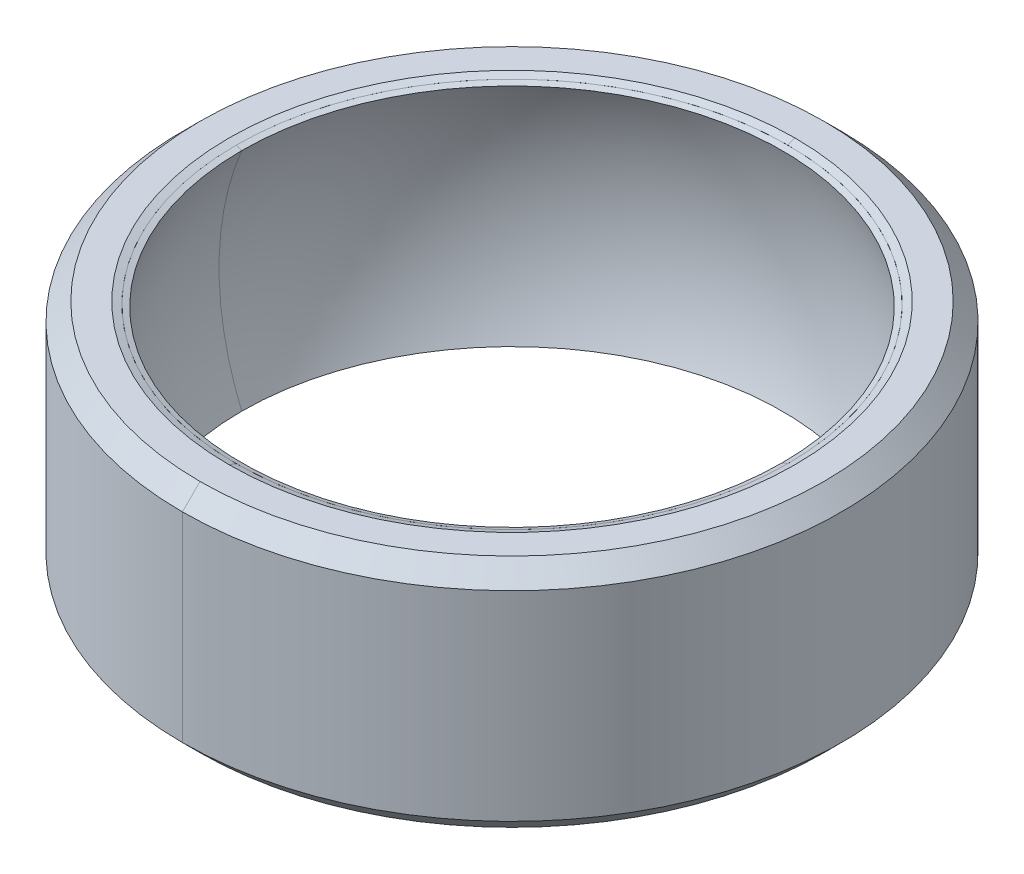
ISO-10303-21;
HEADER;
FILE_DESCRIPTION(('STEP AP214'),'2;1');
FILE_NAME('part.step','',(''),(''),'','','');
FILE_SCHEMA(('AUTOMOTIVE_DESIGN { 1 0 10303 214 1 1 1 1 }'));
ENDSEC;
DATA;
#1=APPLICATION_CONTEXT('core data for automotive mechanical design processes');
#2=APPLICATION_PROTOCOL_DEFINITION('international standard','automotive_design',2000,#1);
#3=PRODUCT_CONTEXT('',#1,'mechanical');
#4=PRODUCT('Part','Part','',(#3));
#5=PRODUCT_RELATED_PRODUCT_CATEGORY('part','',(#4));
#6=PRODUCT_DEFINITION_FORMATION('','',#4);
#7=PRODUCT_DEFINITION_CONTEXT('part definition',#1,'design');
#8=PRODUCT_DEFINITION('design','',#6,#7);
#9=PRODUCT_DEFINITION_SHAPE('','',#8);
#10=(LENGTH_UNIT() NAMED_UNIT(*) SI_UNIT(.MILLI.,.METRE.));
#11=(NAMED_UNIT(*) PLANE_ANGLE_UNIT() SI_UNIT($,.RADIAN.));
#12=(NAMED_UNIT(*) SI_UNIT($,.STERADIAN.) SOLID_ANGLE_UNIT());
#13=UNCERTAINTY_MEASURE_WITH_UNIT(LENGTH_MEASURE(1.E-05),#10,'distance_accuracy_value','');
#14=(GEOMETRIC_REPRESENTATION_CONTEXT(3) GLOBAL_UNCERTAINTY_ASSIGNED_CONTEXT((#13)) GLOBAL_UNIT_ASSIGNED_CONTEXT((#10,
#11,#12)) REPRESENTATION_CONTEXT('',''));
#15=CARTESIAN_POINT('',(0.,0.,0.));
#16=DIRECTION('',(0.,0.,1.));
#17=DIRECTION('',(1.,0.,0.));
#18=AXIS2_PLACEMENT_3D('',#15,#16,#17);
#19=CARTESIAN_POINT('',(0.,0.,0.));
#20=DIRECTION('',(0.,1.,0.));
#21=DIRECTION('',(0.,0.,-1.));
#22=AXIS2_PLACEMENT_3D('',#19,#20,#21);
#23=CYLINDRICAL_SURFACE('',#22,14.2875);
#24=DIRECTION('',(0.,1.,0.));
#25=VECTOR('',#24,1.);
#26=CARTESIAN_POINT('',(0.,0.,-14.2875));
#27=LINE('',#26,#25);
#28=CARTESIAN_POINT('',(0.,-4.3307,-14.2875));
#29=VERTEX_POINT('',#28);
#30=CARTESIAN_POINT('',(0.,4.3307,-14.2875));
#31=VERTEX_POINT('',#30);
#32=EDGE_CURVE('E30',#29,#31,#27,.T.);
#33=ORIENTED_EDGE('',*,*,#32,.F.);
#34=CARTESIAN_POINT('',(0.,-4.3307,0.));
#35=DIRECTION('',(0.,1.,0.));
#36=DIRECTION('',(0.,0.,-1.));
#37=AXIS2_PLACEMENT_3D('',#34,#35,#36);
#38=CIRCLE('',#37,14.2875);
#39=CARTESIAN_POINT('',(0.,-4.3307,14.2875));
#40=VERTEX_POINT('',#39);
#41=EDGE_CURVE('E267',#29,#40,#38,.T.);
#42=ORIENTED_EDGE('',*,*,#41,.T.);
#43=DIRECTION('',(0.,-1.,0.));
#44=VECTOR('',#43,1.);
#45=CARTESIAN_POINT('',(0.,0.,14.2875));
#46=LINE('',#45,#44);
#47=CARTESIAN_POINT('',(0.,4.3307,14.2875));
#48=VERTEX_POINT('',#47);
#49=EDGE_CURVE('E11',#48,#40,#46,.T.);
#50=ORIENTED_EDGE('',*,*,#49,.F.);
#51=CARTESIAN_POINT('',(0.,4.3307,0.));
#52=DIRECTION('',(0.,-1.,0.));
#53=DIRECTION('',(0.,0.,-1.));
#54=AXIS2_PLACEMENT_3D('',#51,#52,#53);
#55=CIRCLE('',#54,14.2875);
#56=EDGE_CURVE('E157',#48,#31,#55,.T.);
#57=ORIENTED_EDGE('',*,*,#56,.T.);
#58=EDGE_LOOP('',(#33,#42,#50,#57));
#59=FACE_BOUND('',#58,.T.);
#60=ADVANCED_FACE('F17',(#59),#23,.T.);
#61=CARTESIAN_POINT('',(0.,0.,0.));
#62=DIRECTION('',(0.,1.,0.));
#63=DIRECTION('',(0.,0.,-1.));
#64=AXIS2_PLACEMENT_3D('',#61,#62,#63);
#65=CYLINDRICAL_SURFACE('',#64,14.2875);
#66=ORIENTED_EDGE('',*,*,#32,.T.);
#67=CARTESIAN_POINT('',(0.,4.3307,0.));
#68=DIRECTION('',(0.,-1.,0.));
#69=DIRECTION('',(0.,0.,-1.));
#70=AXIS2_PLACEMENT_3D('',#67,#68,#69);
#71=CIRCLE('',#70,14.2875);
#72=EDGE_CURVE('E282',#31,#48,#71,.T.);
#73=ORIENTED_EDGE('',*,*,#72,.T.);
#74=ORIENTED_EDGE('',*,*,#49,.T.);
#75=CARTESIAN_POINT('',(0.,-4.3307,0.));
#76=DIRECTION('',(0.,1.,0.));
#77=DIRECTION('',(0.,0.,-1.));
#78=AXIS2_PLACEMENT_3D('',#75,#76,#77);
#79=CIRCLE('',#78,14.2875);
#80=EDGE_CURVE('E23',#40,#29,#79,.T.);
#81=ORIENTED_EDGE('',*,*,#80,.T.);
#82=EDGE_LOOP('',(#66,#73,#74,#81));
#83=FACE_BOUND('',#82,.T.);
#84=ADVANCED_FACE('F424',(#83),#65,.T.);
#85=CARTESIAN_POINT('',(0.,-4.7117,0.));
#86=DIRECTION('',(0.,1.,0.));
#87=DIRECTION('',(0.,0.,-1.));
#88=AXIS2_PLACEMENT_3D('',#85,#86,#87);
#89=CONICAL_SURFACE('',#88,13.9065,0.785398163397449);
#90=DIRECTION('',(0.,-0.707106781186547,0.707106781186548));
#91=VECTOR('',#90,1.);
#92=CARTESIAN_POINT('',(0.,-4.7117,-13.9065));
#93=LINE('',#92,#91);
#94=CARTESIAN_POINT('',(0.,-5.0927,-13.5255));
#95=VERTEX_POINT('',#94);
#96=EDGE_CURVE('E289',#29,#95,#93,.T.);
#97=ORIENTED_EDGE('',*,*,#96,.T.);
#98=CARTESIAN_POINT('',(0.,-5.0927,0.));
#99=DIRECTION('',(0.,-1.,0.));
#100=DIRECTION('',(0.,0.,-1.));
#101=AXIS2_PLACEMENT_3D('',#98,#99,#100);
#102=CIRCLE('',#101,13.5255);
#103=CARTESIAN_POINT('',(0.,-5.0927,13.5255));
#104=VERTEX_POINT('',#103);
#105=EDGE_CURVE('E189',#104,#95,#102,.T.);
#106=ORIENTED_EDGE('',*,*,#105,.F.);
#107=DIRECTION('',(0.,0.707106781186547,0.707106781186548));
#108=VECTOR('',#107,1.);
#109=CARTESIAN_POINT('',(0.,-4.7117,13.9065));
#110=LINE('',#109,#108);
#111=EDGE_CURVE('E270',#104,#40,#110,.T.);
#112=ORIENTED_EDGE('',*,*,#111,.T.);
#113=ORIENTED_EDGE('',*,*,#41,.F.);
#114=EDGE_LOOP('',(#97,#106,#112,#113));
#115=FACE_BOUND('',#114,.T.);
#116=ADVANCED_FACE('F379',(#115),#89,.T.);
#117=CARTESIAN_POINT('',(0.,4.7117,0.));
#118=DIRECTION('',(0.,-1.,0.));
#119=DIRECTION('',(0.,0.,-1.));
#120=AXIS2_PLACEMENT_3D('',#117,#118,#119);
#121=CONICAL_SURFACE('',#120,13.9065,0.785398163397449);
#122=DIRECTION('',(0.,0.707106781186547,0.707106781186548));
#123=VECTOR('',#122,1.);
#124=CARTESIAN_POINT('',(0.,4.7117,-13.9065));
#125=LINE('',#124,#123);
#126=CARTESIAN_POINT('',(0.,5.0927,-13.5255));
#127=VERTEX_POINT('',#126);
#128=EDGE_CURVE('E274',#31,#127,#125,.T.);
#129=ORIENTED_EDGE('',*,*,#128,.F.);
#130=ORIENTED_EDGE('',*,*,#56,.F.);
#131=DIRECTION('',(0.,-0.707106781186547,0.707106781186548));
#132=VECTOR('',#131,1.);
#133=CARTESIAN_POINT('',(0.,4.7117,13.9065));
#134=LINE('',#133,#132);
#135=CARTESIAN_POINT('',(0.,5.0927,13.5255));
#136=VERTEX_POINT('',#135);
#137=EDGE_CURVE('E278',#136,#48,#134,.T.);
#138=ORIENTED_EDGE('',*,*,#137,.F.);
#139=CARTESIAN_POINT('',(0.,5.0927,0.));
#140=DIRECTION('',(0.,1.,0.));
#141=DIRECTION('',(0.,0.,-1.));
#142=AXIS2_PLACEMENT_3D('',#139,#140,#141);
#143=CIRCLE('',#142,13.5255);
#144=EDGE_CURVE('E161',#127,#136,#143,.T.);
#145=ORIENTED_EDGE('',*,*,#144,.F.);
#146=EDGE_LOOP('',(#129,#130,#138,#145));
#147=FACE_BOUND('',#146,.T.);
#148=ADVANCED_FACE('F423',(#147),#121,.T.);
#149=CARTESIAN_POINT('',(0.,4.7117,0.));
#150=DIRECTION('',(0.,-1.,0.));
#151=DIRECTION('',(0.,0.,-1.));
#152=AXIS2_PLACEMENT_3D('',#149,#150,#151);
#153=CONICAL_SURFACE('',#152,13.9065,0.785398163397449);
#154=ORIENTED_EDGE('',*,*,#128,.T.);
#155=CARTESIAN_POINT('',(0.,5.0927,0.));
#156=DIRECTION('',(0.,1.,0.));
#157=DIRECTION('',(0.,0.,-1.));
#158=AXIS2_PLACEMENT_3D('',#155,#156,#157);
#159=CIRCLE('',#158,13.5255);
#160=EDGE_CURVE('E190',#136,#127,#159,.T.);
#161=ORIENTED_EDGE('',*,*,#160,.F.);
#162=ORIENTED_EDGE('',*,*,#137,.T.);
#163=ORIENTED_EDGE('',*,*,#72,.F.);
#164=EDGE_LOOP('',(#154,#161,#162,#163));
#165=FACE_BOUND('',#164,.T.);
#166=ADVANCED_FACE('F462',(#165),#153,.T.);
#167=CARTESIAN_POINT('',(0.,-4.7117,0.));
#168=DIRECTION('',(0.,1.,0.));
#169=DIRECTION('',(0.,0.,-1.));
#170=AXIS2_PLACEMENT_3D('',#167,#168,#169);
#171=CONICAL_SURFACE('',#170,13.9065,0.785398163397449);
#172=ORIENTED_EDGE('',*,*,#96,.F.);
#173=ORIENTED_EDGE('',*,*,#80,.F.);
#174=ORIENTED_EDGE('',*,*,#111,.F.);
#175=CARTESIAN_POINT('',(0.,-5.0927,0.));
#176=DIRECTION('',(0.,-1.,0.));
#177=DIRECTION('',(0.,0.,-1.));
#178=AXIS2_PLACEMENT_3D('',#175,#176,#177);
#179=CIRCLE('',#178,13.5255);
#180=EDGE_CURVE('E185',#95,#104,#179,.T.);
#181=ORIENTED_EDGE('',*,*,#180,.F.);
#182=EDGE_LOOP('',(#172,#173,#174,#181));
#183=FACE_BOUND('',#182,.T.);
#184=ADVANCED_FACE('F387',(#183),#171,.T.);
#185=CARTESIAN_POINT('',(0.,-5.0927,0.));
#186=DIRECTION('',(0.,-1.,0.));
#187=DIRECTION('',(0.,0.,-1.));
#188=AXIS2_PLACEMENT_3D('',#185,#186,#187);
#189=PLANE('',#188);
#190=ORIENTED_EDGE('',*,*,#180,.T.);
#191=ORIENTED_EDGE('',*,*,#105,.T.);
#192=EDGE_LOOP('',(#190,#191));
#193=FACE_BOUND('',#192,.T.);
#194=CARTESIAN_POINT('',(0.,-5.0927,0.));
#195=DIRECTION('',(0.,1.,0.));
#196=DIRECTION('',(0.,0.,-1.));
#197=AXIS2_PLACEMENT_3D('',#194,#195,#196);
#198=CIRCLE('',#197,12.2691912787267);
#199=CARTESIAN_POINT('',(0.,-5.0927,-12.2691912787267));
#200=VERTEX_POINT('',#199);
#201=CARTESIAN_POINT('',(0.,-5.0927,12.2691912787267));
#202=VERTEX_POINT('',#201);
#203=EDGE_CURVE('E159',#200,#202,#198,.T.);
#204=ORIENTED_EDGE('',*,*,#203,.T.);
#205=CARTESIAN_POINT('',(0.,-5.0927,0.));
#206=DIRECTION('',(0.,1.,0.));
#207=DIRECTION('',(0.,0.,-1.));
#208=AXIS2_PLACEMENT_3D('',#205,#206,#207);
#209=CIRCLE('',#208,12.2691912787267);
#210=EDGE_CURVE('E181',#202,#200,#209,.T.);
#211=ORIENTED_EDGE('',*,*,#210,.T.);
#212=EDGE_LOOP('',(#204,#211));
#213=FACE_BOUND('',#212,.T.);
#214=ADVANCED_FACE('F385',(#193,#213),#189,.T.);
#215=CARTESIAN_POINT('',(0.,5.0927,0.));
#216=DIRECTION('',(0.,1.,0.));
#217=DIRECTION('',(1.,0.,0.));
#218=AXIS2_PLACEMENT_3D('',#215,#216,#217);
#219=PLANE('',#218);
#220=ORIENTED_EDGE('',*,*,#144,.T.);
#221=ORIENTED_EDGE('',*,*,#160,.T.);
#222=EDGE_LOOP('',(#220,#221));
#223=FACE_BOUND('',#222,.T.);
#224=CARTESIAN_POINT('',(0.,5.0927,0.));
#225=DIRECTION('',(0.,-1.,0.));
#226=DIRECTION('',(0.,0.,-1.));
#227=AXIS2_PLACEMENT_3D('',#224,#225,#226);
#228=CIRCLE('',#227,12.2691912787267);
#229=CARTESIAN_POINT('',(0.,5.0927,-12.2691912787267));
#230=VERTEX_POINT('',#229);
#231=CARTESIAN_POINT('',(0.,5.0927,12.2691912787267));
#232=VERTEX_POINT('',#231);
#233=EDGE_CURVE('E118',#230,#232,#228,.T.);
#234=ORIENTED_EDGE('',*,*,#233,.T.);
#235=CARTESIAN_POINT('',(0.,5.0927,0.));
#236=DIRECTION('',(0.,-1.,0.));
#237=DIRECTION('',(0.,0.,-1.));
#238=AXIS2_PLACEMENT_3D('',#235,#236,#237);
#239=CIRCLE('',#238,12.2691912787267);
#240=EDGE_CURVE('E126',#232,#230,#239,.T.);
#241=ORIENTED_EDGE('',*,*,#240,.T.);
#242=EDGE_LOOP('',(#234,#241));
#243=FACE_BOUND('',#242,.T.);
#244=ADVANCED_FACE('F124',(#223,#243),#219,.T.);
#245=CARTESIAN_POINT('',(0.,-4.97713945062048,0.));
#246=DIRECTION('',(0.,-1.,0.));
#247=DIRECTION('',(0.,0.,-1.));
#248=AXIS2_PLACEMENT_3D('',#245,#246,#247);
#249=CONICAL_SURFACE('',#248,11.9516912787267,1.22173047639603);
#250=DIRECTION('',(0.,0.342020143325669,0.939692620785908));
#251=VECTOR('',#250,1.);
#252=CARTESIAN_POINT('',(0.,-4.97713945062048,-11.9516912787267));
#253=LINE('',#252,#251);
#254=CARTESIAN_POINT('',(0.,-4.97968635832331,-11.9586888501296));
#255=VERTEX_POINT('',#254);
#256=EDGE_CURVE('E129',#200,#255,#253,.T.);
#257=ORIENTED_EDGE('',*,*,#256,.T.);
#258=CARTESIAN_POINT('',(0.,-4.97968635832331,0.));
#259=DIRECTION('',(0.,1.,0.));
#260=DIRECTION('',(0.,0.,-1.));
#261=AXIS2_PLACEMENT_3D('',#258,#259,#260);
#262=CIRCLE('',#261,11.9586888501296);
#263=CARTESIAN_POINT('',(-11.9586888501296,-4.97968635832331,0.));
#264=VERTEX_POINT('',#263);
#265=EDGE_CURVE('E178',#255,#264,#262,.T.);
#266=ORIENTED_EDGE('',*,*,#265,.T.);
#267=CARTESIAN_POINT('',(0.,-4.97968635832331,0.));
#268=DIRECTION('',(0.,1.,0.));
#269=DIRECTION('',(0.,0.,-1.));
#270=AXIS2_PLACEMENT_3D('',#267,#268,#269);
#271=CIRCLE('',#270,11.9586888501296);
#272=CARTESIAN_POINT('',(0.,-4.97968635832331,11.9586888501296));
#273=VERTEX_POINT('',#272);
#274=EDGE_CURVE('E169',#264,#273,#271,.T.);
#275=ORIENTED_EDGE('',*,*,#274,.T.);
#276=DIRECTION('',(0.,-0.342020143325669,0.939692620785908));
#277=VECTOR('',#276,1.);
#278=CARTESIAN_POINT('',(0.,-4.97713945062048,11.9516912787267));
#279=LINE('',#278,#277);
#280=EDGE_CURVE('E162',#273,#202,#279,.T.);
#281=ORIENTED_EDGE('',*,*,#280,.T.);
#282=ORIENTED_EDGE('',*,*,#203,.F.);
#283=EDGE_LOOP('',(#257,#266,#275,#281,#282));
#284=FACE_BOUND('',#283,.T.);
#285=ADVANCED_FACE('F401',(#284),#249,.F.);
#286=CARTESIAN_POINT('',(0.,-4.97713945062048,0.));
#287=DIRECTION('',(0.,-1.,0.));
#288=DIRECTION('',(0.,0.,-1.));
#289=AXIS2_PLACEMENT_3D('',#286,#287,#288);
#290=CONICAL_SURFACE('',#289,11.9516912787267,1.22173047639603);
#291=ORIENTED_EDGE('',*,*,#256,.F.);
#292=ORIENTED_EDGE('',*,*,#210,.F.);
#293=ORIENTED_EDGE('',*,*,#280,.F.);
#294=CARTESIAN_POINT('',(0.,-4.97968635832331,0.));
#295=DIRECTION('',(0.,1.,0.));
#296=DIRECTION('',(0.,0.,-1.));
#297=AXIS2_PLACEMENT_3D('',#294,#295,#296);
#298=CIRCLE('',#297,11.9586888501296);
#299=CARTESIAN_POINT('',(11.9586888501296,-4.97968635832331,0.));
#300=VERTEX_POINT('',#299);
#301=EDGE_CURVE('E174',#273,#300,#298,.T.);
#302=ORIENTED_EDGE('',*,*,#301,.T.);
#303=CARTESIAN_POINT('',(0.,-4.97968635832331,0.));
#304=DIRECTION('',(0.,1.,0.));
#305=DIRECTION('',(0.,0.,-1.));
#306=AXIS2_PLACEMENT_3D('',#303,#304,#305);
#307=CIRCLE('',#306,11.9586888501296);
#308=EDGE_CURVE('E153',#300,#255,#307,.T.);
#309=ORIENTED_EDGE('',*,*,#308,.T.);
#310=EDGE_LOOP('',(#291,#292,#293,#302,#309));
#311=FACE_BOUND('',#310,.T.);
#312=ADVANCED_FACE('F434',(#311),#290,.F.);
#313=CARTESIAN_POINT('',(0.,4.97713945062048,0.));
#314=DIRECTION('',(0.,1.,0.));
#315=DIRECTION('',(0.,0.,-1.));
#316=AXIS2_PLACEMENT_3D('',#313,#314,#315);
#317=CONICAL_SURFACE('',#316,11.9516912787267,1.22173047639603);
#318=DIRECTION('',(0.,-0.342020143325669,0.939692620785908));
#319=VECTOR('',#318,1.);
#320=CARTESIAN_POINT('',(0.,4.97713945062048,-11.9516912787267));
#321=LINE('',#320,#319);
#322=CARTESIAN_POINT('',(0.,4.97968635832332,-11.9586888501297));
#323=VERTEX_POINT('',#322);
#324=EDGE_CURVE('E145',#230,#323,#321,.T.);
#325=ORIENTED_EDGE('',*,*,#324,.T.);
#326=CARTESIAN_POINT('',(0.,4.97968635832332,0.));
#327=DIRECTION('',(0.,-1.,0.));
#328=DIRECTION('',(0.,0.,-1.));
#329=AXIS2_PLACEMENT_3D('',#326,#327,#328);
#330=CIRCLE('',#329,11.9586888501297);
#331=CARTESIAN_POINT('',(11.9586888501297,4.97968635832331,0.));
#332=VERTEX_POINT('',#331);
#333=EDGE_CURVE('E191',#323,#332,#330,.T.);
#334=ORIENTED_EDGE('',*,*,#333,.T.);
#335=CARTESIAN_POINT('',(0.,4.97968635832332,0.));
#336=DIRECTION('',(0.,-1.,0.));
#337=DIRECTION('',(0.,0.,-1.));
#338=AXIS2_PLACEMENT_3D('',#335,#336,#337);
#339=CIRCLE('',#338,11.9586888501297);
#340=CARTESIAN_POINT('',(0.,4.97968635832332,11.9586888501297));
#341=VERTEX_POINT('',#340);
#342=EDGE_CURVE('E137',#332,#341,#339,.T.);
#343=ORIENTED_EDGE('',*,*,#342,.T.);
#344=DIRECTION('',(0.,0.342020143325669,0.939692620785908));
#345=VECTOR('',#344,1.);
#346=CARTESIAN_POINT('',(0.,4.97713945062048,11.9516912787267));
#347=LINE('',#346,#345);
#348=EDGE_CURVE('E130',#341,#232,#347,.T.);
#349=ORIENTED_EDGE('',*,*,#348,.T.);
#350=ORIENTED_EDGE('',*,*,#233,.F.);
#351=EDGE_LOOP('',(#325,#334,#343,#349,#350));
#352=FACE_BOUND('',#351,.T.);
#353=ADVANCED_FACE('F134',(#352),#317,.F.);
#354=CARTESIAN_POINT('',(0.,4.97713945062048,0.));
#355=DIRECTION('',(0.,1.,0.));
#356=DIRECTION('',(0.,0.,-1.));
#357=AXIS2_PLACEMENT_3D('',#354,#355,#356);
#358=CONICAL_SURFACE('',#357,11.9516912787267,1.22173047639603);
#359=ORIENTED_EDGE('',*,*,#324,.F.);
#360=ORIENTED_EDGE('',*,*,#240,.F.);
#361=ORIENTED_EDGE('',*,*,#348,.F.);
#362=CARTESIAN_POINT('',(0.,4.97968635832332,0.));
#363=DIRECTION('',(0.,-1.,0.));
#364=DIRECTION('',(0.,0.,-1.));
#365=AXIS2_PLACEMENT_3D('',#362,#363,#364);
#366=CIRCLE('',#365,11.9586888501297);
#367=CARTESIAN_POINT('',(-11.9586888501297,4.97968635832332,0.));
#368=VERTEX_POINT('',#367);
#369=EDGE_CURVE('E167',#341,#368,#366,.T.);
#370=ORIENTED_EDGE('',*,*,#369,.T.);
#371=CARTESIAN_POINT('',(0.,4.97968635832332,0.));
#372=DIRECTION('',(0.,-1.,0.));
#373=DIRECTION('',(0.,0.,-1.));
#374=AXIS2_PLACEMENT_3D('',#371,#372,#373);
#375=CIRCLE('',#374,11.9586888501297);
#376=EDGE_CURVE('E194',#368,#323,#375,.T.);
#377=ORIENTED_EDGE('',*,*,#376,.T.);
#378=EDGE_LOOP('',(#359,#360,#361,#370,#377));
#379=FACE_BOUND('',#378,.T.);
#380=ADVANCED_FACE('F143',(#379),#358,.F.);
#381=CARTESIAN_POINT('',(0.,-12.9470176034255,0.));
#382=CARTESIAN_POINT('',(0.,-12.9470176034255,0.));
#383=CARTESIAN_POINT('',(0.,-12.9470176034255,0.));
#384=CARTESIAN_POINT('',(0.,-12.9470176034255,0.));
#385=CARTESIAN_POINT('',(0.,-12.9470176034255,0.));
#386=CARTESIAN_POINT('',(-7.47835114850054,-12.9514190059336,0.));
#387=CARTESIAN_POINT('',(-7.47835114850054,-12.9514190059336,-7.47835114850054));
#388=CARTESIAN_POINT('',(0.,-12.9514190059336,-7.47835114850054));
#389=CARTESIAN_POINT('',(7.47835114850053,-12.9514190059336,-7.47835114850054));
#390=CARTESIAN_POINT('',(7.47835114850053,-12.9514190059336,0.));
#391=CARTESIAN_POINT('',(-11.2187978739344,-6.47570950296678,0.));
#392=CARTESIAN_POINT('',(-11.2187978739344,-6.47570950296677,-11.2187978739344));
#393=CARTESIAN_POINT('',(0.,-6.47570950296678,-11.2187978739344));
#394=CARTESIAN_POINT('',(11.2187978739344,-6.47570950296678,-11.2187978739344));
#395=CARTESIAN_POINT('',(11.2187978739344,-6.47570950296678,0.));
#396=CARTESIAN_POINT('',(-14.9592445993683,0.,0.));
#397=CARTESIAN_POINT('',(-14.9592445993683,0.,-14.9592445993683));
#398=CARTESIAN_POINT('',(0.,0.,-14.9592445993683));
#399=CARTESIAN_POINT('',(14.9592445993683,0.,-14.9592445993683));
#400=CARTESIAN_POINT('',(14.9592445993683,0.,0.));
#401=CARTESIAN_POINT('',(-11.2187978739344,6.47570950296681,0.));
#402=CARTESIAN_POINT('',(-11.2187978739344,6.47570950296681,-11.2187978739344));
#403=CARTESIAN_POINT('',(0.,6.47570950296681,-11.2187978739344));
#404=CARTESIAN_POINT('',(11.2187978739344,6.47570950296681,-11.2187978739344));
#405=CARTESIAN_POINT('',(11.2187978739344,6.4757095029668,0.));
#406=CARTESIAN_POINT('',(-7.47835114850053,12.9514190059336,0.));
#407=CARTESIAN_POINT('',(-7.47835114850053,12.9514190059336,-7.47835114850053));
#408=CARTESIAN_POINT('',(0.,12.9514190059336,-7.47835114850053));
#409=CARTESIAN_POINT('',(7.47835114850053,12.9514190059336,-7.47835114850053));
#410=CARTESIAN_POINT('',(7.47835114850054,12.9514190059336,0.));
#411=CARTESIAN_POINT('',(0.,12.9470176034255,0.));
#412=CARTESIAN_POINT('',(0.,12.9470176034255,0.));
#413=CARTESIAN_POINT('',(0.,12.9470176034255,0.));
#414=CARTESIAN_POINT('',(0.,12.9470176034255,0.));
#415=CARTESIAN_POINT('',(0.,12.9470176034255,0.));
#416=(BOUNDED_SURFACE() B_SPLINE_SURFACE(2,2,((#381,#382,#383,#384,#385),(#386,#387,#388,#389,
#390),(#391,#392,#393,#394,#395),(#396,#397,#398,#399,#400),(#401,#402,#403,#404,#405),(#406,
#407,#408,#409,#410),(#411,#412,#413,#414,#415)),.UNSPECIFIED.,.F.,.F.,
.F.) B_SPLINE_SURFACE_WITH_KNOTS((3,2,2,3),(3,2,3),(1.57020777433026,2.61779769383662,
3.66538761334297,4.71297753284933),(3.14159265358979,4.71238898038469,6.28318530717959),
.UNSPECIFIED.) GEOMETRIC_REPRESENTATION_ITEM() RATIONAL_B_SPLINE_SURFACE(((1.,0.707106781186548,
1.,0.707106781186548,1.),(0.865927295041737,0.612303062338536,0.865927295041737,
0.612303062338536,0.865927295041737),(1.,0.707106781186548,1.,0.707106781186548,1.),
(0.86592729504174,0.612303062338538,0.86592729504174,0.612303062338538,0.86592729504174),(1.,
0.707106781186548,1.,0.707106781186548,1.),(0.865927295041741,0.61230306233854,
0.865927295041741,0.61230306233854,0.865927295041741),(1.,0.707106781186548,1.,
0.707106781186548,1.))) REPRESENTATION_ITEM('') SURFACE());
#417=CARTESIAN_POINT('',(0.00762000000002172,0.,0.));
#418=DIRECTION('',(0.,0.,-1.));
#419=DIRECTION('',(1.,0.,0.));
#420=AXIS2_PLACEMENT_3D('',#417,#418,#419);
#421=CIRCLE('',#420,12.9470198458105);
#422=CARTESIAN_POINT('',(11.9586666452284,-4.97973964895602,0.));
#423=VERTEX_POINT('',#422);
#424=EDGE_CURVE('E208',#300,#423,#421,.T.);
#425=CARTESIAN_POINT('',(0.,-4.97973964895601,0.));
#426=DIRECTION('',(0.,1.,0.));
#427=DIRECTION('',(1.,0.,0.));
#428=AXIS2_PLACEMENT_3D('',#425,#426,#427);
#429=CIRCLE('',#428,11.9586666452284);
#430=CARTESIAN_POINT('',(-11.9586666452284,-4.97973964895601,0.));
#431=VERTEX_POINT('',#430);
#432=EDGE_CURVE('E201',#423,#431,#429,.T.);
#433=CARTESIAN_POINT('',(-0.00762000000002172,0.,0.));
#434=DIRECTION('',(0.,0.,-1.));
#435=DIRECTION('',(-1.,0.,0.));
#436=AXIS2_PLACEMENT_3D('',#433,#434,#435);
#437=CIRCLE('',#436,12.9470198458105);
#438=EDGE_CURVE('E173',#431,#264,#437,.T.);
#439=ORIENTED_EDGE('',*,*,#424,.T.);
#440=ORIENTED_EDGE('',*,*,#432,.T.);
#441=ORIENTED_EDGE('',*,*,#438,.T.);
#442=ORIENTED_EDGE('',*,*,#265,.F.);
#443=ORIENTED_EDGE('',*,*,#308,.F.);
#444=EDGE_LOOP('',(#439,#440,#441,#442,#443));
#445=FACE_BOUND('',#444,.T.);
#446=ADVANCED_FACE('F413',(#445),#416,.T.);
#447=CARTESIAN_POINT('',(0.,-12.9470176034255,0.));
#448=CARTESIAN_POINT('',(0.,-12.9470176034255,0.));
#449=CARTESIAN_POINT('',(0.,-12.9470176034255,0.));
#450=CARTESIAN_POINT('',(0.,-12.9470176034255,0.));
#451=CARTESIAN_POINT('',(0.,-12.9470176034255,0.));
#452=CARTESIAN_POINT('',(7.47835114850053,-12.9514190059336,0.));
#453=CARTESIAN_POINT('',(7.47835114850053,-12.9514190059336,7.47835114850053));
#454=CARTESIAN_POINT('',(0.,-12.9514190059336,7.47835114850054));
#455=CARTESIAN_POINT('',(-7.47835114850054,-12.9514190059336,7.47835114850053));
#456=CARTESIAN_POINT('',(-7.47835114850054,-12.9514190059336,0.));
#457=CARTESIAN_POINT('',(11.2187978739344,-6.47570950296678,0.));
#458=CARTESIAN_POINT('',(11.2187978739344,-6.47570950296678,11.2187978739344));
#459=CARTESIAN_POINT('',(0.,-6.47570950296678,11.2187978739344));
#460=CARTESIAN_POINT('',(-11.2187978739344,-6.47570950296678,11.2187978739344));
#461=CARTESIAN_POINT('',(-11.2187978739344,-6.47570950296678,0.));
#462=CARTESIAN_POINT('',(14.9592445993683,0.,0.));
#463=CARTESIAN_POINT('',(14.9592445993683,0.,14.9592445993683));
#464=CARTESIAN_POINT('',(0.,0.,14.9592445993683));
#465=CARTESIAN_POINT('',(-14.9592445993683,0.,14.9592445993683));
#466=CARTESIAN_POINT('',(-14.9592445993683,0.,0.));
#467=CARTESIAN_POINT('',(11.2187978739344,6.4757095029668,0.));
#468=CARTESIAN_POINT('',(11.2187978739344,6.47570950296681,11.2187978739344));
#469=CARTESIAN_POINT('',(0.,6.4757095029668,11.2187978739344));
#470=CARTESIAN_POINT('',(-11.2187978739344,6.47570950296681,11.2187978739344));
#471=CARTESIAN_POINT('',(-11.2187978739344,6.47570950296681,0.));
#472=CARTESIAN_POINT('',(7.47835114850054,12.9514190059336,0.));
#473=CARTESIAN_POINT('',(7.47835114850053,12.9514190059336,7.47835114850053));
#474=CARTESIAN_POINT('',(0.,12.9514190059336,7.47835114850054));
#475=CARTESIAN_POINT('',(-7.47835114850053,12.9514190059336,7.47835114850053));
#476=CARTESIAN_POINT('',(-7.47835114850053,12.9514190059336,0.));
#477=CARTESIAN_POINT('',(0.,12.9470176034255,0.));
#478=CARTESIAN_POINT('',(0.,12.9470176034255,0.));
#479=CARTESIAN_POINT('',(0.,12.9470176034255,0.));
#480=CARTESIAN_POINT('',(0.,12.9470176034255,0.));
#481=CARTESIAN_POINT('',(0.,12.9470176034255,0.));
#482=(BOUNDED_SURFACE() B_SPLINE_SURFACE(2,2,((#447,#448,#449,#450,#451),(#452,#453,#454,#455,
#456),(#457,#458,#459,#460,#461),(#462,#463,#464,#465,#466),(#467,#468,#469,#470,#471),(#472,
#473,#474,#475,#476),(#477,#478,#479,#480,#481)),.UNSPECIFIED.,.F.,.F.,
.F.) B_SPLINE_SURFACE_WITH_KNOTS((3,2,2,3),(3,2,3),(1.57020777433026,2.61779769383662,
3.66538761334297,4.71297753284933),(0.,1.5707963267949,3.14159265358979),
.UNSPECIFIED.) GEOMETRIC_REPRESENTATION_ITEM() RATIONAL_B_SPLINE_SURFACE(((1.,0.707106781186548,
1.,0.707106781186548,1.),(0.865927295041737,0.612303062338536,0.865927295041737,
0.612303062338536,0.865927295041737),(1.,0.707106781186548,1.,0.707106781186548,1.),
(0.86592729504174,0.612303062338538,0.86592729504174,0.612303062338538,0.86592729504174),(1.,
0.707106781186548,1.,0.707106781186548,1.),(0.865927295041741,0.61230306233854,
0.865927295041741,0.61230306233854,0.865927295041741),(1.,0.707106781186548,1.,
0.707106781186548,1.))) REPRESENTATION_ITEM('') SURFACE());
#483=CARTESIAN_POINT('',(0.,-4.97973964895601,0.));
#484=DIRECTION('',(0.,1.,0.));
#485=DIRECTION('',(1.,0.,0.));
#486=AXIS2_PLACEMENT_3D('',#483,#484,#485);
#487=CIRCLE('',#486,11.9586666452284);
#488=EDGE_CURVE('E237',#431,#423,#487,.T.);
#489=ORIENTED_EDGE('',*,*,#424,.F.);
#490=ORIENTED_EDGE('',*,*,#301,.F.);
#491=ORIENTED_EDGE('',*,*,#274,.F.);
#492=ORIENTED_EDGE('',*,*,#438,.F.);
#493=ORIENTED_EDGE('',*,*,#488,.T.);
#494=EDGE_LOOP('',(#489,#490,#491,#492,#493));
#495=FACE_BOUND('',#494,.T.);
#496=ADVANCED_FACE('F481',(#495),#482,.T.);
#497=CARTESIAN_POINT('',(0.,-12.9470176034255,0.));
#498=CARTESIAN_POINT('',(0.,-12.9470176034255,0.));
#499=CARTESIAN_POINT('',(0.,-12.9470176034255,0.));
#500=CARTESIAN_POINT('',(0.,-12.9470176034255,0.));
#501=CARTESIAN_POINT('',(0.,-12.9470176034255,0.));
#502=CARTESIAN_POINT('',(-7.47835114850054,-12.9514190059336,0.));
#503=CARTESIAN_POINT('',(-7.47835114850054,-12.9514190059336,-7.47835114850054));
#504=CARTESIAN_POINT('',(0.,-12.9514190059336,-7.47835114850054));
#505=CARTESIAN_POINT('',(7.47835114850053,-12.9514190059336,-7.47835114850054));
#506=CARTESIAN_POINT('',(7.47835114850053,-12.9514190059336,0.));
#507=CARTESIAN_POINT('',(-11.2187978739344,-6.47570950296678,0.));
#508=CARTESIAN_POINT('',(-11.2187978739344,-6.47570950296677,-11.2187978739344));
#509=CARTESIAN_POINT('',(0.,-6.47570950296678,-11.2187978739344));
#510=CARTESIAN_POINT('',(11.2187978739344,-6.47570950296678,-11.2187978739344));
#511=CARTESIAN_POINT('',(11.2187978739344,-6.47570950296678,0.));
#512=CARTESIAN_POINT('',(-14.9592445993683,0.,0.));
#513=CARTESIAN_POINT('',(-14.9592445993683,0.,-14.9592445993683));
#514=CARTESIAN_POINT('',(0.,0.,-14.9592445993683));
#515=CARTESIAN_POINT('',(14.9592445993683,0.,-14.9592445993683));
#516=CARTESIAN_POINT('',(14.9592445993683,0.,0.));
#517=CARTESIAN_POINT('',(-11.2187978739344,6.47570950296681,0.));
#518=CARTESIAN_POINT('',(-11.2187978739344,6.47570950296681,-11.2187978739344));
#519=CARTESIAN_POINT('',(0.,6.47570950296681,-11.2187978739344));
#520=CARTESIAN_POINT('',(11.2187978739344,6.47570950296681,-11.2187978739344));
#521=CARTESIAN_POINT('',(11.2187978739344,6.4757095029668,0.));
#522=CARTESIAN_POINT('',(-7.47835114850053,12.9514190059336,0.));
#523=CARTESIAN_POINT('',(-7.47835114850053,12.9514190059336,-7.47835114850053));
#524=CARTESIAN_POINT('',(0.,12.9514190059336,-7.47835114850053));
#525=CARTESIAN_POINT('',(7.47835114850053,12.9514190059336,-7.47835114850053));
#526=CARTESIAN_POINT('',(7.47835114850054,12.9514190059336,0.));
#527=CARTESIAN_POINT('',(0.,12.9470176034255,0.));
#528=CARTESIAN_POINT('',(0.,12.9470176034255,0.));
#529=CARTESIAN_POINT('',(0.,12.9470176034255,0.));
#530=CARTESIAN_POINT('',(0.,12.9470176034255,0.));
#531=CARTESIAN_POINT('',(0.,12.9470176034255,0.));
#532=(BOUNDED_SURFACE() B_SPLINE_SURFACE(2,2,((#497,#498,#499,#500,#501),(#502,#503,#504,#505,
#506),(#507,#508,#509,#510,#511),(#512,#513,#514,#515,#516),(#517,#518,#519,#520,#521),(#522,
#523,#524,#525,#526),(#527,#528,#529,#530,#531)),.UNSPECIFIED.,.F.,.F.,
.F.) B_SPLINE_SURFACE_WITH_KNOTS((3,2,2,3),(3,2,3),(1.57020777433026,2.61779769383662,
3.66538761334297,4.71297753284933),(3.14159265358979,4.71238898038469,6.28318530717959),
.UNSPECIFIED.) GEOMETRIC_REPRESENTATION_ITEM() RATIONAL_B_SPLINE_SURFACE(((1.,0.707106781186548,
1.,0.707106781186548,1.),(0.865927295041737,0.612303062338536,0.865927295041737,
0.612303062338536,0.865927295041737),(1.,0.707106781186548,1.,0.707106781186548,1.),
(0.86592729504174,0.612303062338538,0.86592729504174,0.612303062338538,0.86592729504174),(1.,
0.707106781186548,1.,0.707106781186548,1.),(0.865927295041741,0.61230306233854,
0.865927295041741,0.61230306233854,0.865927295041741),(1.,0.707106781186548,1.,
0.707106781186548,1.))) REPRESENTATION_ITEM('') SURFACE());
#533=CARTESIAN_POINT('',(0.00762000000002172,0.,0.));
#534=DIRECTION('',(0.,0.,-1.));
#535=DIRECTION('',(1.,0.,0.));
#536=AXIS2_PLACEMENT_3D('',#533,#534,#535);
#537=CIRCLE('',#536,12.9470198458105);
#538=CARTESIAN_POINT('',(11.9586666452285,4.97973964895601,0.));
#539=VERTEX_POINT('',#538);
#540=EDGE_CURVE('E168',#539,#332,#537,.T.);
#541=CARTESIAN_POINT('',(-0.00762000000002172,0.,0.));
#542=DIRECTION('',(0.,0.,-1.));
#543=DIRECTION('',(-1.,0.,0.));
#544=AXIS2_PLACEMENT_3D('',#541,#542,#543);
#545=CIRCLE('',#544,12.9470198458105);
#546=CARTESIAN_POINT('',(-11.9586666452285,4.97973964895602,0.));
#547=VERTEX_POINT('',#546);
#548=EDGE_CURVE('E163',#368,#547,#545,.T.);
#549=CARTESIAN_POINT('',(0.,4.97973964895602,0.));
#550=DIRECTION('',(0.,-1.,0.));
#551=DIRECTION('',(1.,0.,0.));
#552=AXIS2_PLACEMENT_3D('',#549,#550,#551);
#553=CIRCLE('',#552,11.9586666452285);
#554=EDGE_CURVE('E238',#547,#539,#553,.T.);
#555=ORIENTED_EDGE('',*,*,#540,.T.);
#556=ORIENTED_EDGE('',*,*,#333,.F.);
#557=ORIENTED_EDGE('',*,*,#376,.F.);
#558=ORIENTED_EDGE('',*,*,#548,.T.);
#559=ORIENTED_EDGE('',*,*,#554,.T.);
#560=EDGE_LOOP('',(#555,#556,#557,#558,#559));
#561=FACE_BOUND('',#560,.T.);
#562=ADVANCED_FACE('F346',(#561),#532,.T.);
#563=CARTESIAN_POINT('',(0.,-12.9470176034255,0.));
#564=CARTESIAN_POINT('',(0.,-12.9470176034255,0.));
#565=CARTESIAN_POINT('',(0.,-12.9470176034255,0.));
#566=CARTESIAN_POINT('',(0.,-12.9470176034255,0.));
#567=CARTESIAN_POINT('',(0.,-12.9470176034255,0.));
#568=CARTESIAN_POINT('',(7.47835114850053,-12.9514190059336,0.));
#569=CARTESIAN_POINT('',(7.47835114850053,-12.9514190059336,7.47835114850053));
#570=CARTESIAN_POINT('',(0.,-12.9514190059336,7.47835114850054));
#571=CARTESIAN_POINT('',(-7.47835114850054,-12.9514190059336,7.47835114850053));
#572=CARTESIAN_POINT('',(-7.47835114850054,-12.9514190059336,0.));
#573=CARTESIAN_POINT('',(11.2187978739344,-6.47570950296678,0.));
#574=CARTESIAN_POINT('',(11.2187978739344,-6.47570950296678,11.2187978739344));
#575=CARTESIAN_POINT('',(0.,-6.47570950296678,11.2187978739344));
#576=CARTESIAN_POINT('',(-11.2187978739344,-6.47570950296678,11.2187978739344));
#577=CARTESIAN_POINT('',(-11.2187978739344,-6.47570950296678,0.));
#578=CARTESIAN_POINT('',(14.9592445993683,0.,0.));
#579=CARTESIAN_POINT('',(14.9592445993683,0.,14.9592445993683));
#580=CARTESIAN_POINT('',(0.,0.,14.9592445993683));
#581=CARTESIAN_POINT('',(-14.9592445993683,0.,14.9592445993683));
#582=CARTESIAN_POINT('',(-14.9592445993683,0.,0.));
#583=CARTESIAN_POINT('',(11.2187978739344,6.4757095029668,0.));
#584=CARTESIAN_POINT('',(11.2187978739344,6.47570950296681,11.2187978739344));
#585=CARTESIAN_POINT('',(0.,6.4757095029668,11.2187978739344));
#586=CARTESIAN_POINT('',(-11.2187978739344,6.47570950296681,11.2187978739344));
#587=CARTESIAN_POINT('',(-11.2187978739344,6.47570950296681,0.));
#588=CARTESIAN_POINT('',(7.47835114850054,12.9514190059336,0.));
#589=CARTESIAN_POINT('',(7.47835114850053,12.9514190059336,7.47835114850053));
#590=CARTESIAN_POINT('',(0.,12.9514190059336,7.47835114850054));
#591=CARTESIAN_POINT('',(-7.47835114850053,12.9514190059336,7.47835114850053));
#592=CARTESIAN_POINT('',(-7.47835114850053,12.9514190059336,0.));
#593=CARTESIAN_POINT('',(0.,12.9470176034255,0.));
#594=CARTESIAN_POINT('',(0.,12.9470176034255,0.));
#595=CARTESIAN_POINT('',(0.,12.9470176034255,0.));
#596=CARTESIAN_POINT('',(0.,12.9470176034255,0.));
#597=CARTESIAN_POINT('',(0.,12.9470176034255,0.));
#598=(BOUNDED_SURFACE() B_SPLINE_SURFACE(2,2,((#563,#564,#565,#566,#567),(#568,#569,#570,#571,
#572),(#573,#574,#575,#576,#577),(#578,#579,#580,#581,#582),(#583,#584,#585,#586,#587),(#588,
#589,#590,#591,#592),(#593,#594,#595,#596,#597)),.UNSPECIFIED.,.F.,.F.,
.F.) B_SPLINE_SURFACE_WITH_KNOTS((3,2,2,3),(3,2,3),(1.57020777433026,2.61779769383662,
3.66538761334297,4.71297753284933),(0.,1.5707963267949,3.14159265358979),
.UNSPECIFIED.) GEOMETRIC_REPRESENTATION_ITEM() RATIONAL_B_SPLINE_SURFACE(((1.,0.707106781186548,
1.,0.707106781186548,1.),(0.865927295041737,0.612303062338536,0.865927295041737,
0.612303062338536,0.865927295041737),(1.,0.707106781186548,1.,0.707106781186548,1.),
(0.86592729504174,0.612303062338538,0.86592729504174,0.612303062338538,0.86592729504174),(1.,
0.707106781186548,1.,0.707106781186548,1.),(0.865927295041741,0.61230306233854,
0.865927295041741,0.61230306233854,0.865927295041741),(1.,0.707106781186548,1.,
0.707106781186548,1.))) REPRESENTATION_ITEM('') SURFACE());
#599=CARTESIAN_POINT('',(0.,4.97973964895602,0.));
#600=DIRECTION('',(0.,-1.,0.));
#601=DIRECTION('',(1.,0.,0.));
#602=AXIS2_PLACEMENT_3D('',#599,#600,#601);
#603=CIRCLE('',#602,11.9586666452285);
#604=EDGE_CURVE('E262',#539,#547,#603,.T.);
#605=ORIENTED_EDGE('',*,*,#540,.F.);
#606=ORIENTED_EDGE('',*,*,#604,.T.);
#607=ORIENTED_EDGE('',*,*,#548,.F.);
#608=ORIENTED_EDGE('',*,*,#369,.F.);
#609=ORIENTED_EDGE('',*,*,#342,.F.);
#610=EDGE_LOOP('',(#605,#606,#607,#608,#609));
#611=FACE_BOUND('',#610,.T.);
#612=ADVANCED_FACE('F343',(#611),#598,.T.);
#613=CARTESIAN_POINT('',(0.,-2.86110223872508,0.));
#614=DIRECTION('',(0.,-1.,0.));
#615=DIRECTION('',(1.,0.,0.));
#616=AXIS2_PLACEMENT_3D('',#613,#614,#615);
#617=CONICAL_SURFACE('',#616,6.13459563936334,1.22190500932123);
#618=DIRECTION('',(0.93975230024936,-0.341856130815343,0.));
#619=VECTOR('',#618,1.);
#620=CARTESIAN_POINT('',(6.13459563936334,-2.86110223872508,0.));
#621=LINE('',#620,#619);
#622=CARTESIAN_POINT('',(11.7197127508152,-4.89281477123485,0.));
#623=VERTEX_POINT('',#622);
#624=EDGE_CURVE('E234',#623,#423,#621,.T.);
#625=ORIENTED_EDGE('',*,*,#624,.F.);
#626=CARTESIAN_POINT('',(0.,-4.89281477123485,0.));
#627=DIRECTION('',(0.,-1.,0.));
#628=DIRECTION('',(1.,0.,0.));
#629=AXIS2_PLACEMENT_3D('',#626,#627,#628);
#630=CIRCLE('',#629,11.7197127508152);
#631=CARTESIAN_POINT('',(-11.7197127508152,-4.89281477123484,0.));
#632=VERTEX_POINT('',#631);
#633=EDGE_CURVE('E200',#632,#623,#630,.T.);
#634=ORIENTED_EDGE('',*,*,#633,.F.);
#635=DIRECTION('',(0.93975230024936,0.341856130815342,0.));
#636=VECTOR('',#635,1.);
#637=CARTESIAN_POINT('',(-6.13459563936334,-2.86110223872508,0.));
#638=LINE('',#637,#636);
#639=EDGE_CURVE('E205',#431,#632,#638,.T.);
#640=ORIENTED_EDGE('',*,*,#639,.F.);
#641=ORIENTED_EDGE('',*,*,#432,.F.);
#642=EDGE_LOOP('',(#625,#634,#640,#641));
#643=FACE_BOUND('',#642,.T.);
#644=ADVANCED_FACE('F323',(#643),#617,.F.);
#645=CARTESIAN_POINT('',(0.,-2.86110223872508,0.));
#646=DIRECTION('',(0.,-1.,0.));
#647=DIRECTION('',(1.,0.,0.));
#648=AXIS2_PLACEMENT_3D('',#645,#646,#647);
#649=CONICAL_SURFACE('',#648,6.13459563936334,1.22190500932123);
#650=ORIENTED_EDGE('',*,*,#624,.T.);
#651=ORIENTED_EDGE('',*,*,#488,.F.);
#652=ORIENTED_EDGE('',*,*,#639,.T.);
#653=CARTESIAN_POINT('',(0.,-4.89281477123485,0.));
#654=DIRECTION('',(0.,-1.,0.));
#655=DIRECTION('',(1.,0.,0.));
#656=AXIS2_PLACEMENT_3D('',#653,#654,#655);
#657=CIRCLE('',#656,11.7197127508152);
#658=EDGE_CURVE('E212',#623,#632,#657,.T.);
#659=ORIENTED_EDGE('',*,*,#658,.F.);
#660=EDGE_LOOP('',(#650,#651,#652,#659));
#661=FACE_BOUND('',#660,.T.);
#662=ADVANCED_FACE('F318',(#661),#649,.F.);
#663=CARTESIAN_POINT('',(0.,2.86110223872508,0.));
#664=DIRECTION('',(0.,1.,0.));
#665=DIRECTION('',(1.,0.,0.));
#666=AXIS2_PLACEMENT_3D('',#663,#664,#665);
#667=CONICAL_SURFACE('',#666,6.13459563936334,1.22190500932123);
#668=DIRECTION('',(0.93975230024936,0.341856130815342,0.));
#669=VECTOR('',#668,1.);
#670=CARTESIAN_POINT('',(6.13459563936334,2.86110223872508,0.));
#671=LINE('',#670,#669);
#672=CARTESIAN_POINT('',(11.7197127508152,4.89281477123484,0.));
#673=VERTEX_POINT('',#672);
#674=EDGE_CURVE('E199',#673,#539,#671,.T.);
#675=ORIENTED_EDGE('',*,*,#674,.T.);
#676=ORIENTED_EDGE('',*,*,#554,.F.);
#677=DIRECTION('',(0.93975230024936,-0.341856130815343,0.));
#678=VECTOR('',#677,1.);
#679=CARTESIAN_POINT('',(-6.13459563936334,2.86110223872508,0.));
#680=LINE('',#679,#678);
#681=CARTESIAN_POINT('',(-11.7197127508152,4.89281477123485,0.));
#682=VERTEX_POINT('',#681);
#683=EDGE_CURVE('E266',#547,#682,#680,.T.);
#684=ORIENTED_EDGE('',*,*,#683,.T.);
#685=CARTESIAN_POINT('',(0.,4.89281477123484,0.));
#686=DIRECTION('',(0.,1.,0.));
#687=DIRECTION('',(1.,0.,0.));
#688=AXIS2_PLACEMENT_3D('',#685,#686,#687);
#689=CIRCLE('',#688,11.7197127508152);
#690=EDGE_CURVE('E195',#673,#682,#689,.T.);
#691=ORIENTED_EDGE('',*,*,#690,.F.);
#692=EDGE_LOOP('',(#675,#676,#684,#691));
#693=FACE_BOUND('',#692,.T.);
#694=ADVANCED_FACE('F337',(#693),#667,.F.);
#695=CARTESIAN_POINT('',(0.,2.86110223872508,0.));
#696=DIRECTION('',(0.,1.,0.));
#697=DIRECTION('',(1.,0.,0.));
#698=AXIS2_PLACEMENT_3D('',#695,#696,#697);
#699=CONICAL_SURFACE('',#698,6.13459563936334,1.22190500932123);
#700=ORIENTED_EDGE('',*,*,#674,.F.);
#701=CARTESIAN_POINT('',(0.,4.89281477123484,0.));
#702=DIRECTION('',(0.,1.,0.));
#703=DIRECTION('',(1.,0.,0.));
#704=AXIS2_PLACEMENT_3D('',#701,#702,#703);
#705=CIRCLE('',#704,11.7197127508152);
#706=EDGE_CURVE('E223',#682,#673,#705,.T.);
#707=ORIENTED_EDGE('',*,*,#706,.F.);
#708=ORIENTED_EDGE('',*,*,#683,.F.);
#709=ORIENTED_EDGE('',*,*,#604,.F.);
#710=EDGE_LOOP('',(#700,#707,#708,#709));
#711=FACE_BOUND('',#710,.T.);
#712=ADVANCED_FACE('F334',(#711),#699,.F.);
#713=CARTESIAN_POINT('',(0.,-12.6930175657687,0.));
#714=CARTESIAN_POINT('',(0.,-12.6930175657687,0.));
#715=CARTESIAN_POINT('',(0.,-12.6930175657687,0.));
#716=CARTESIAN_POINT('',(0.,-12.6930175657687,0.));
#717=CARTESIAN_POINT('',(0.,-12.6930175657687,0.));
#718=CARTESIAN_POINT('',(-7.33170416604905,-12.6974190081724,0.));
#719=CARTESIAN_POINT('',(-7.33170416604905,-12.6974190081724,-7.33170416604905));
#720=CARTESIAN_POINT('',(0.,-12.6974190081724,-7.33170416604905));
#721=CARTESIAN_POINT('',(7.33170416604905,-12.6974190081724,-7.33170416604905));
#722=CARTESIAN_POINT('',(7.33170416604905,-12.6974190081724,0.));
#723=CARTESIAN_POINT('',(-10.9988274233015,-6.34870950408621,0.));
#724=CARTESIAN_POINT('',(-10.9988274233015,-6.34870950408621,-10.9988274233015));
#725=CARTESIAN_POINT('',(0.,-6.34870950408621,-10.9988274233015));
#726=CARTESIAN_POINT('',(10.9988274233015,-6.34870950408622,-10.9988274233015));
#727=CARTESIAN_POINT('',(10.9988274233015,-6.34870950408622,0.));
#728=CARTESIAN_POINT('',(-14.6659506805539,0.,0.));
#729=CARTESIAN_POINT('',(-14.6659506805539,0.,-14.6659506805539));
#730=CARTESIAN_POINT('',(0.,0.,-14.6659506805539));
#731=CARTESIAN_POINT('',(14.6659506805539,0.,-14.6659506805539));
#732=CARTESIAN_POINT('',(14.6659506805539,0.,0.));
#733=CARTESIAN_POINT('',(-10.9988274233015,6.34870950408619,0.));
#734=CARTESIAN_POINT('',(-10.9988274233015,6.34870950408619,-10.9988274233015));
#735=CARTESIAN_POINT('',(0.,6.34870950408619,-10.9988274233015));
#736=CARTESIAN_POINT('',(10.9988274233015,6.34870950408619,-10.9988274233015));
#737=CARTESIAN_POINT('',(10.9988274233015,6.34870950408619,0.));
#738=CARTESIAN_POINT('',(-7.33170416604905,12.6974190081724,0.));
#739=CARTESIAN_POINT('',(-7.33170416604905,12.6974190081724,-7.33170416604905));
#740=CARTESIAN_POINT('',(0.,12.6974190081724,-7.33170416604905));
#741=CARTESIAN_POINT('',(7.33170416604905,12.6974190081724,-7.33170416604905));
#742=CARTESIAN_POINT('',(7.33170416604906,12.6974190081724,0.));
#743=CARTESIAN_POINT('',(0.,12.6930175657687,0.));
#744=CARTESIAN_POINT('',(0.,12.6930175657687,0.));
#745=CARTESIAN_POINT('',(0.,12.6930175657687,0.));
#746=CARTESIAN_POINT('',(0.,12.6930175657687,0.));
#747=CARTESIAN_POINT('',(0.,12.6930175657687,0.));
#748=(BOUNDED_SURFACE() B_SPLINE_SURFACE(2,2,((#713,#714,#715,#716,#717),(#718,#719,#720,#721,
#722),(#723,#724,#725,#726,#727),(#728,#729,#730,#731,#732),(#733,#734,#735,#736,#737),(#738,
#739,#740,#741,#742),(#743,#744,#745,#746,#747)),.UNSPECIFIED.,.F.,.F.,
.F.) B_SPLINE_SURFACE_WITH_KNOTS((3,2,2,3),(3,2,3),(1.57019599680677,2.61779376799545,
3.66539153918414,4.71298931037282),(3.14159265358979,4.71238898038469,6.28318530717959),
.UNSPECIFIED.) GEOMETRIC_REPRESENTATION_ITEM() RATIONAL_B_SPLINE_SURFACE(((1.,0.707106781186548,
1.,0.707106781186548,1.),(0.865925331447519,0.612301673867749,0.865925331447519,
0.612301673867749,0.865925331447519),(1.,0.707106781186548,1.,0.707106781186548,1.),
(0.86592533144752,0.61230167386775,0.86592533144752,0.61230167386775,0.86592533144752),(1.,
0.707106781186548,1.,0.707106781186548,1.),(0.86592533144752,0.61230167386775,0.86592533144752,
0.61230167386775,0.86592533144752),(1.,0.707106781186548,1.,0.707106781186548,1.))) REPRESENTATION_ITEM('') SURFACE());
#749=CARTESIAN_POINT('',(-0.00762000000001749,0.,0.));
#750=DIRECTION('',(0.,0.,-1.));
#751=DIRECTION('',(-1.,0.,0.));
#752=AXIS2_PLACEMENT_3D('',#749,#750,#751);
#753=CIRCLE('',#752,12.693019853026);
#754=EDGE_CURVE('E219',#632,#682,#753,.T.);
#755=CARTESIAN_POINT('',(0.00762000000001749,0.,0.));
#756=DIRECTION('',(0.,0.,-1.));
#757=DIRECTION('',(1.,0.,0.));
#758=AXIS2_PLACEMENT_3D('',#755,#756,#757);
#759=CIRCLE('',#758,12.693019853026);
#760=EDGE_CURVE('E261',#673,#623,#759,.T.);
#761=ORIENTED_EDGE('',*,*,#754,.F.);
#762=ORIENTED_EDGE('',*,*,#633,.T.);
#763=ORIENTED_EDGE('',*,*,#760,.F.);
#764=ORIENTED_EDGE('',*,*,#690,.T.);
#765=EDGE_LOOP('',(#761,#762,#763,#764));
#766=FACE_BOUND('',#765,.T.);
#767=ADVANCED_FACE('F328',(#766),#748,.F.);
#768=CARTESIAN_POINT('',(0.,-12.6930175657687,0.));
#769=CARTESIAN_POINT('',(0.,-12.6930175657687,0.));
#770=CARTESIAN_POINT('',(0.,-12.6930175657687,0.));
#771=CARTESIAN_POINT('',(0.,-12.6930175657687,0.));
#772=CARTESIAN_POINT('',(0.,-12.6930175657687,0.));
#773=CARTESIAN_POINT('',(7.33170416604905,-12.6974190081724,0.));
#774=CARTESIAN_POINT('',(7.33170416604905,-12.6974190081724,7.33170416604905));
#775=CARTESIAN_POINT('',(0.,-12.6974190081724,7.33170416604905));
#776=CARTESIAN_POINT('',(-7.33170416604905,-12.6974190081724,7.33170416604905));
#777=CARTESIAN_POINT('',(-7.33170416604905,-12.6974190081724,0.));
#778=CARTESIAN_POINT('',(10.9988274233015,-6.34870950408622,0.));
#779=CARTESIAN_POINT('',(10.9988274233015,-6.34870950408622,10.9988274233015));
#780=CARTESIAN_POINT('',(0.,-6.34870950408622,10.9988274233015));
#781=CARTESIAN_POINT('',(-10.9988274233015,-6.34870950408621,10.9988274233015));
#782=CARTESIAN_POINT('',(-10.9988274233015,-6.34870950408621,0.));
#783=CARTESIAN_POINT('',(14.6659506805539,0.,0.));
#784=CARTESIAN_POINT('',(14.6659506805539,0.,14.6659506805539));
#785=CARTESIAN_POINT('',(0.,0.,14.6659506805539));
#786=CARTESIAN_POINT('',(-14.6659506805539,0.,14.6659506805539));
#787=CARTESIAN_POINT('',(-14.6659506805539,0.,0.));
#788=CARTESIAN_POINT('',(10.9988274233015,6.34870950408619,0.));
#789=CARTESIAN_POINT('',(10.9988274233015,6.34870950408619,10.9988274233015));
#790=CARTESIAN_POINT('',(0.,6.34870950408619,10.9988274233015));
#791=CARTESIAN_POINT('',(-10.9988274233015,6.34870950408619,10.9988274233015));
#792=CARTESIAN_POINT('',(-10.9988274233015,6.34870950408619,0.));
#793=CARTESIAN_POINT('',(7.33170416604906,12.6974190081724,0.));
#794=CARTESIAN_POINT('',(7.33170416604905,12.6974190081724,7.33170416604905));
#795=CARTESIAN_POINT('',(0.,12.6974190081724,7.33170416604905));
#796=CARTESIAN_POINT('',(-7.33170416604905,12.6974190081724,7.33170416604905));
#797=CARTESIAN_POINT('',(-7.33170416604905,12.6974190081724,0.));
#798=CARTESIAN_POINT('',(0.,12.6930175657687,0.));
#799=CARTESIAN_POINT('',(0.,12.6930175657687,0.));
#800=CARTESIAN_POINT('',(0.,12.6930175657687,0.));
#801=CARTESIAN_POINT('',(0.,12.6930175657687,0.));
#802=CARTESIAN_POINT('',(0.,12.6930175657687,0.));
#803=(BOUNDED_SURFACE() B_SPLINE_SURFACE(2,2,((#768,#769,#770,#771,#772),(#773,#774,#775,#776,
#777),(#778,#779,#780,#781,#782),(#783,#784,#785,#786,#787),(#788,#789,#790,#791,#792),(#793,
#794,#795,#796,#797),(#798,#799,#800,#801,#802)),.UNSPECIFIED.,.F.,.F.,
.F.) B_SPLINE_SURFACE_WITH_KNOTS((3,2,2,3),(3,2,3),(1.57019599680677,2.61779376799545,
3.66539153918414,4.71298931037282),(0.,1.5707963267949,3.14159265358979),
.UNSPECIFIED.) GEOMETRIC_REPRESENTATION_ITEM() RATIONAL_B_SPLINE_SURFACE(((1.,0.707106781186548,
1.,0.707106781186548,1.),(0.865925331447519,0.612301673867749,0.865925331447519,
0.612301673867749,0.865925331447519),(1.,0.707106781186548,1.,0.707106781186548,1.),
(0.86592533144752,0.61230167386775,0.86592533144752,0.61230167386775,0.86592533144752),(1.,
0.707106781186548,1.,0.707106781186548,1.),(0.86592533144752,0.61230167386775,0.86592533144752,
0.61230167386775,0.86592533144752),(1.,0.707106781186548,1.,0.707106781186548,1.))) REPRESENTATION_ITEM('') SURFACE());
#804=ORIENTED_EDGE('',*,*,#754,.T.);
#805=ORIENTED_EDGE('',*,*,#706,.T.);
#806=ORIENTED_EDGE('',*,*,#760,.T.);
#807=ORIENTED_EDGE('',*,*,#658,.T.);
#808=EDGE_LOOP('',(#804,#805,#806,#807));
#809=FACE_BOUND('',#808,.T.);
#810=ADVANCED_FACE('F19',(#809),#803,.F.);
#811=CLOSED_SHELL('',(#60,#84,#116,#148,#166,#184,#214,#244,#285,#312,#353,#380,#446,#496,#562,
#612,#644,#662,#694,#712,#767,#810));
#812=MANIFOLD_SOLID_BREP('B1',#811);
#813=ADVANCED_BREP_SHAPE_REPRESENTATION('',(#18,#812),#14);
#814=SHAPE_DEFINITION_REPRESENTATION(#9,#813);
ENDSEC;
END-ISO-10303-21;
